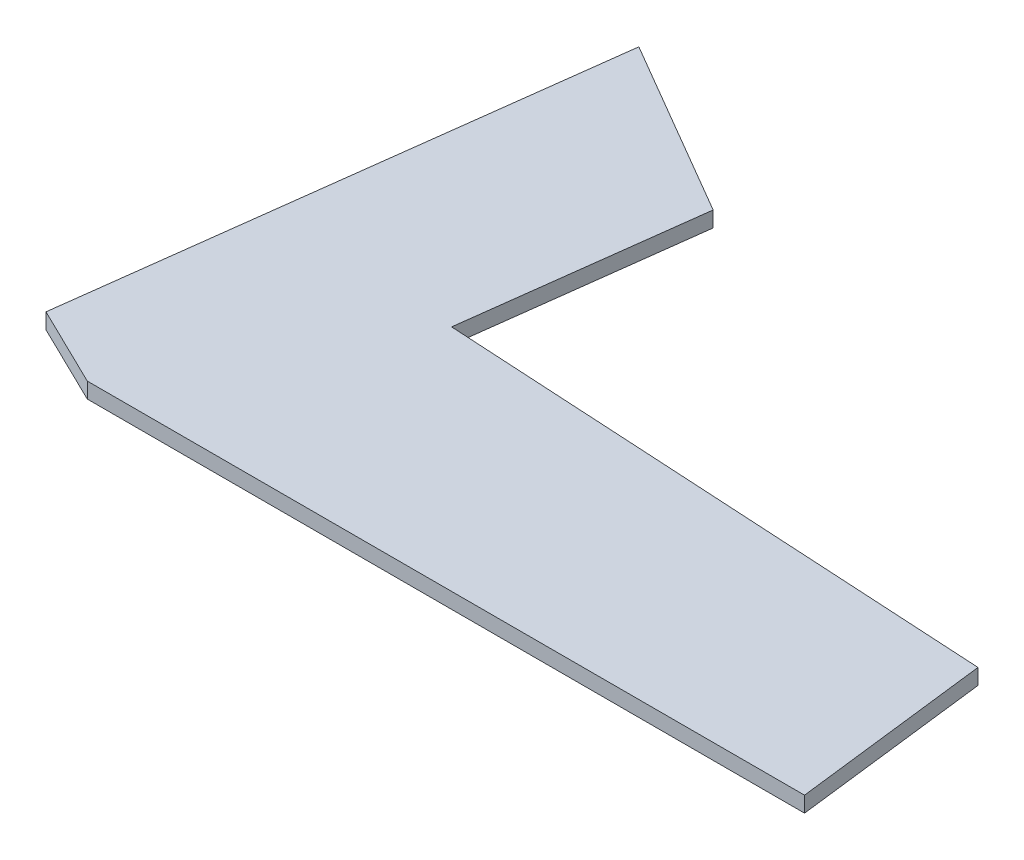
ISO-10303-21;
HEADER;
FILE_DESCRIPTION(('STEP AP214'),'2;1');
FILE_NAME('part.step','',(''),(''),'','','');
FILE_SCHEMA(('AUTOMOTIVE_DESIGN { 1 0 10303 214 1 1 1 1 }'));
ENDSEC;
DATA;
#1=APPLICATION_CONTEXT('core data for automotive mechanical design processes');
#2=APPLICATION_PROTOCOL_DEFINITION('international standard','automotive_design',2000,#1);
#3=PRODUCT_CONTEXT('',#1,'mechanical');
#4=PRODUCT('Part','Part','',(#3));
#5=PRODUCT_RELATED_PRODUCT_CATEGORY('part','',(#4));
#6=PRODUCT_DEFINITION_FORMATION('','',#4);
#7=PRODUCT_DEFINITION_CONTEXT('part definition',#1,'design');
#8=PRODUCT_DEFINITION('design','',#6,#7);
#9=PRODUCT_DEFINITION_SHAPE('','',#8);
#10=(LENGTH_UNIT() NAMED_UNIT(*) SI_UNIT(.MILLI.,.METRE.));
#11=(NAMED_UNIT(*) PLANE_ANGLE_UNIT() SI_UNIT($,.RADIAN.));
#12=(NAMED_UNIT(*) SI_UNIT($,.STERADIAN.) SOLID_ANGLE_UNIT());
#13=UNCERTAINTY_MEASURE_WITH_UNIT(LENGTH_MEASURE(1.E-05),#10,'distance_accuracy_value','');
#14=(GEOMETRIC_REPRESENTATION_CONTEXT(3) GLOBAL_UNCERTAINTY_ASSIGNED_CONTEXT((#13)) GLOBAL_UNIT_ASSIGNED_CONTEXT((#10,
#11,#12)) REPRESENTATION_CONTEXT('',''));
#15=CARTESIAN_POINT('',(0.,0.,0.));
#16=DIRECTION('',(0.,0.,1.));
#17=DIRECTION('',(1.,0.,0.));
#18=AXIS2_PLACEMENT_3D('',#15,#16,#17);
#19=CARTESIAN_POINT('',(35.7922680722665,1.,2.03372718008394));
#20=DIRECTION('',(-0.0567287916341405,0.,0.998389625446764));
#21=DIRECTION('',(0.998389625446764,0.,0.0567287916341405));
#22=AXIS2_PLACEMENT_3D('',#19,#20,#21);
#23=PLANE('',#22);
#24=DIRECTION('',(-0.998389625446764,0.,-0.0567287916341405));
#25=VECTOR('',#24,1.);
#26=CARTESIAN_POINT('',(35.7922680722665,0.,2.03372718008394));
#27=LINE('',#26,#25);
#28=CARTESIAN_POINT('',(35.7922680722665,0.,2.03372718008394));
#29=VERTEX_POINT('',#28);
#30=CARTESIAN_POINT('',(0.,0.,0.));
#31=VERTEX_POINT('',#30);
#32=EDGE_CURVE('E134',#29,#31,#27,.T.);
#33=ORIENTED_EDGE('',*,*,#32,.T.);
#34=DIRECTION('',(0.,-1.,0.));
#35=VECTOR('',#34,1.);
#36=CARTESIAN_POINT('',(0.,1.,0.));
#37=LINE('',#36,#35);
#38=CARTESIAN_POINT('',(0.,1.,0.));
#39=VERTEX_POINT('',#38);
#40=EDGE_CURVE('E11',#39,#31,#37,.T.);
#41=ORIENTED_EDGE('',*,*,#40,.F.);
#42=DIRECTION('',(-0.998389625446764,0.,-0.0567287916341405));
#43=VECTOR('',#42,1.);
#44=CARTESIAN_POINT('',(35.7922680722665,1.,2.03372718008394));
#45=LINE('',#44,#43);
#46=CARTESIAN_POINT('',(35.7922680722665,1.,2.03372718008394));
#47=VERTEX_POINT('',#46);
#48=EDGE_CURVE('E153',#47,#39,#45,.T.);
#49=ORIENTED_EDGE('',*,*,#48,.F.);
#50=DIRECTION('',(0.,-1.,0.));
#51=VECTOR('',#50,1.);
#52=CARTESIAN_POINT('',(35.7922680722665,1.,2.03372718008394));
#53=LINE('',#52,#51);
#54=EDGE_CURVE('E130',#47,#29,#53,.T.);
#55=ORIENTED_EDGE('',*,*,#54,.T.);
#56=EDGE_LOOP('',(#33,#41,#49,#55));
#57=FACE_BOUND('',#56,.T.);
#58=ADVANCED_FACE('F39',(#57),#23,.F.);
#59=CARTESIAN_POINT('',(0.,1.,0.));
#60=DIRECTION('',(-0.9920003980339,0.,-0.126234742842787));
#61=DIRECTION('',(-0.126234742842787,0.,0.9920003980339));
#62=AXIS2_PLACEMENT_3D('',#59,#60,#61);
#63=PLANE('',#62);
#64=DIRECTION('',(0.126234742842787,0.,-0.9920003980339));
#65=VECTOR('',#64,1.);
#66=CARTESIAN_POINT('',(0.,0.,0.));
#67=LINE('',#66,#65);
#68=CARTESIAN_POINT('',(1.8935211426418,0.,-14.8800059705085));
#69=VERTEX_POINT('',#68);
#70=EDGE_CURVE('E138',#31,#69,#67,.T.);
#71=ORIENTED_EDGE('',*,*,#70,.T.);
#72=DIRECTION('',(0.,-1.,0.));
#73=VECTOR('',#72,1.);
#74=CARTESIAN_POINT('',(1.8935211426418,1.,-14.8800059705085));
#75=LINE('',#74,#73);
#76=CARTESIAN_POINT('',(1.8935211426418,1.,-14.8800059705085));
#77=VERTEX_POINT('',#76);
#78=EDGE_CURVE('E48',#77,#69,#75,.T.);
#79=ORIENTED_EDGE('',*,*,#78,.F.);
#80=DIRECTION('',(0.126234742842787,0.,-0.9920003980339));
#81=VECTOR('',#80,1.);
#82=CARTESIAN_POINT('',(0.,1.,0.));
#83=LINE('',#82,#81);
#84=EDGE_CURVE('E96',#39,#77,#83,.T.);
#85=ORIENTED_EDGE('',*,*,#84,.F.);
#86=ORIENTED_EDGE('',*,*,#40,.T.);
#87=EDGE_LOOP('',(#71,#79,#85,#86));
#88=FACE_BOUND('',#87,.T.);
#89=ADVANCED_FACE('F187',(#88),#63,.F.);
#90=CARTESIAN_POINT('',(1.8935211426418,1.,-14.8800059705085));
#91=DIRECTION('',(-0.503985512182175,0.,0.863712106844909));
#92=DIRECTION('',(0.863712106844909,0.,0.503985512182175));
#93=AXIS2_PLACEMENT_3D('',#90,#91,#92);
#94=PLANE('',#93);
#95=DIRECTION('',(-0.863712106844909,0.,-0.503985512182175));
#96=VECTOR('',#95,1.);
#97=CARTESIAN_POINT('',(1.8935211426418,0.,-14.8800059705085));
#98=LINE('',#97,#96);
#99=CARTESIAN_POINT('',(-9.55066427305324,0.,-21.5578140069223));
#100=VERTEX_POINT('',#99);
#101=EDGE_CURVE('E141',#69,#100,#98,.T.);
#102=ORIENTED_EDGE('',*,*,#101,.T.);
#103=DIRECTION('',(0.,-1.,0.));
#104=VECTOR('',#103,1.);
#105=CARTESIAN_POINT('',(-9.55066427305324,1.,-21.5578140069223));
#106=LINE('',#105,#104);
#107=CARTESIAN_POINT('',(-9.55066427305324,1.,-21.5578140069223));
#108=VERTEX_POINT('',#107);
#109=EDGE_CURVE('E160',#108,#100,#106,.T.);
#110=ORIENTED_EDGE('',*,*,#109,.F.);
#111=DIRECTION('',(-0.863712106844909,0.,-0.503985512182175));
#112=VECTOR('',#111,1.);
#113=CARTESIAN_POINT('',(1.8935211426418,1.,-14.8800059705085));
#114=LINE('',#113,#112);
#115=EDGE_CURVE('E170',#77,#108,#114,.T.);
#116=ORIENTED_EDGE('',*,*,#115,.F.);
#117=ORIENTED_EDGE('',*,*,#78,.T.);
#118=EDGE_LOOP('',(#102,#110,#116,#117));
#119=FACE_BOUND('',#118,.T.);
#120=ADVANCED_FACE('F168',(#119),#94,.F.);
#121=CARTESIAN_POINT('',(-9.55066427305324,1.,-21.5578140069223));
#122=DIRECTION('',(0.9920003980339,0.,0.126234742842787));
#123=DIRECTION('',(0.126234742842787,0.,-0.9920003980339));
#124=AXIS2_PLACEMENT_3D('',#121,#122,#123);
#125=PLANE('',#124);
#126=DIRECTION('',(-0.126234742842787,0.,0.9920003980339));
#127=VECTOR('',#126,1.);
#128=CARTESIAN_POINT('',(-9.55066427305324,0.,-21.5578140069223));
#129=LINE('',#128,#127);
#130=CARTESIAN_POINT('',(-13.842645529708,0.,12.1701995262303));
#131=VERTEX_POINT('',#130);
#132=EDGE_CURVE('E144',#100,#131,#129,.T.);
#133=ORIENTED_EDGE('',*,*,#132,.T.);
#134=DIRECTION('',(0.,-1.,0.));
#135=VECTOR('',#134,1.);
#136=CARTESIAN_POINT('',(-13.842645529708,1.,12.1701995262303));
#137=LINE('',#136,#135);
#138=CARTESIAN_POINT('',(-13.842645529708,1.,12.1701995262303));
#139=VERTEX_POINT('',#138);
#140=EDGE_CURVE('E123',#139,#131,#137,.T.);
#141=ORIENTED_EDGE('',*,*,#140,.F.);
#142=DIRECTION('',(-0.126234742842787,0.,0.9920003980339));
#143=VECTOR('',#142,1.);
#144=CARTESIAN_POINT('',(-9.55066427305324,1.,-21.5578140069223));
#145=LINE('',#144,#143);
#146=EDGE_CURVE('E112',#108,#139,#145,.T.);
#147=ORIENTED_EDGE('',*,*,#146,.F.);
#148=ORIENTED_EDGE('',*,*,#109,.T.);
#149=EDGE_LOOP('',(#133,#141,#147,#148));
#150=FACE_BOUND('',#149,.T.);
#151=ADVANCED_FACE('F176',(#150),#125,.F.);
#152=CARTESIAN_POINT('',(-13.842645529708,1.,12.1701995262303));
#153=DIRECTION('',(0.438441247874848,0.,-0.898759852330947));
#154=DIRECTION('',(-0.898759852330947,0.,-0.438441247874848));
#155=AXIS2_PLACEMENT_3D('',#152,#153,#154);
#156=PLANE('',#155);
#157=DIRECTION('',(0.898759852330947,0.,0.438441247874848));
#158=VECTOR('',#157,1.);
#159=CARTESIAN_POINT('',(-13.842645529708,0.,12.1701995262303));
#160=LINE('',#159,#158);
#161=CARTESIAN_POINT('',(-8.67477637880496,0.,14.6912367015107));
#162=VERTEX_POINT('',#161);
#163=EDGE_CURVE('E121',#131,#162,#160,.T.);
#164=ORIENTED_EDGE('',*,*,#163,.T.);
#165=DIRECTION('',(0.,-1.,0.));
#166=VECTOR('',#165,1.);
#167=CARTESIAN_POINT('',(-8.67477637880496,1.,14.6912367015107));
#168=LINE('',#167,#166);
#169=CARTESIAN_POINT('',(-8.67477637880496,1.,14.6912367015107));
#170=VERTEX_POINT('',#169);
#171=EDGE_CURVE('E118',#170,#162,#168,.T.);
#172=ORIENTED_EDGE('',*,*,#171,.F.);
#173=DIRECTION('',(0.898759852330947,0.,0.438441247874848));
#174=VECTOR('',#173,1.);
#175=CARTESIAN_POINT('',(-13.842645529708,1.,12.1701995262303));
#176=LINE('',#175,#174);
#177=EDGE_CURVE('E106',#139,#170,#176,.T.);
#178=ORIENTED_EDGE('',*,*,#177,.F.);
#179=ORIENTED_EDGE('',*,*,#140,.T.);
#180=EDGE_LOOP('',(#164,#172,#178,#179));
#181=FACE_BOUND('',#180,.T.);
#182=ADVANCED_FACE('F119',(#181),#156,.F.);
#183=CARTESIAN_POINT('',(-8.67477637880496,1.,14.6912367015107));
#184=DIRECTION('',(0.,0.,-1.));
#185=DIRECTION('',(-1.,0.,0.));
#186=AXIS2_PLACEMENT_3D('',#183,#184,#185);
#187=PLANE('',#186);
#188=DIRECTION('',(1.,0.,0.));
#189=VECTOR('',#188,1.);
#190=CARTESIAN_POINT('',(-8.67477637880496,0.,14.6912367015107));
#191=LINE('',#190,#189);
#192=CARTESIAN_POINT('',(37.3252236211951,0.,14.6912367015107));
#193=VERTEX_POINT('',#192);
#194=EDGE_CURVE('E82',#162,#193,#191,.T.);
#195=ORIENTED_EDGE('',*,*,#194,.T.);
#196=DIRECTION('',(0.,-1.,0.));
#197=VECTOR('',#196,1.);
#198=CARTESIAN_POINT('',(37.3252236211951,1.,14.6912367015107));
#199=LINE('',#198,#197);
#200=CARTESIAN_POINT('',(37.3252236211951,1.,14.6912367015107));
#201=VERTEX_POINT('',#200);
#202=EDGE_CURVE('E124',#201,#193,#199,.T.);
#203=ORIENTED_EDGE('',*,*,#202,.F.);
#204=DIRECTION('',(1.,0.,0.));
#205=VECTOR('',#204,1.);
#206=CARTESIAN_POINT('',(-8.67477637880496,1.,14.6912367015107));
#207=LINE('',#206,#205);
#208=EDGE_CURVE('E110',#170,#201,#207,.T.);
#209=ORIENTED_EDGE('',*,*,#208,.F.);
#210=ORIENTED_EDGE('',*,*,#171,.T.);
#211=EDGE_LOOP('',(#195,#203,#209,#210));
#212=FACE_BOUND('',#211,.T.);
#213=ADVANCED_FACE('F126',(#212),#187,.F.);
#214=CARTESIAN_POINT('',(37.3252236211951,1.,14.6912367015107));
#215=DIRECTION('',(-0.992745844817785,0.,0.120231807759102));
#216=DIRECTION('',(0.120231807759102,0.,0.992745844817785));
#217=AXIS2_PLACEMENT_3D('',#214,#215,#216);
#218=PLANE('',#217);
#219=DIRECTION('',(-0.120231807759102,0.,-0.992745844817785));
#220=VECTOR('',#219,1.);
#221=CARTESIAN_POINT('',(37.3252236211951,0.,14.6912367015107));
#222=LINE('',#221,#220);
#223=EDGE_CURVE('E88',#193,#29,#222,.T.);
#224=ORIENTED_EDGE('',*,*,#223,.T.);
#225=ORIENTED_EDGE('',*,*,#54,.F.);
#226=DIRECTION('',(-0.120231807759102,0.,-0.992745844817785));
#227=VECTOR('',#226,1.);
#228=CARTESIAN_POINT('',(37.3252236211951,1.,14.6912367015107));
#229=LINE('',#228,#227);
#230=EDGE_CURVE('E56',#201,#47,#229,.T.);
#231=ORIENTED_EDGE('',*,*,#230,.F.);
#232=ORIENTED_EDGE('',*,*,#202,.T.);
#233=EDGE_LOOP('',(#224,#225,#231,#232));
#234=FACE_BOUND('',#233,.T.);
#235=ADVANCED_FACE('F201',(#234),#218,.F.);
#236=CARTESIAN_POINT('',(0.,1.,0.));
#237=DIRECTION('',(0.,-1.,0.));
#238=DIRECTION('',(0.,0.,-1.));
#239=AXIS2_PLACEMENT_3D('',#236,#237,#238);
#240=PLANE('',#239);
#241=ORIENTED_EDGE('',*,*,#48,.T.);
#242=ORIENTED_EDGE('',*,*,#84,.T.);
#243=ORIENTED_EDGE('',*,*,#115,.T.);
#244=ORIENTED_EDGE('',*,*,#146,.T.);
#245=ORIENTED_EDGE('',*,*,#177,.T.);
#246=ORIENTED_EDGE('',*,*,#208,.T.);
#247=ORIENTED_EDGE('',*,*,#230,.T.);
#248=EDGE_LOOP('',(#241,#242,#243,#244,#245,#246,#247));
#249=FACE_BOUND('',#248,.T.);
#250=ADVANCED_FACE('F108',(#249),#240,.F.);
#251=CARTESIAN_POINT('',(0.,0.,0.));
#252=DIRECTION('',(0.,-1.,0.));
#253=DIRECTION('',(0.,0.,-1.));
#254=AXIS2_PLACEMENT_3D('',#251,#252,#253);
#255=PLANE('',#254);
#256=ORIENTED_EDGE('',*,*,#32,.F.);
#257=ORIENTED_EDGE('',*,*,#223,.F.);
#258=ORIENTED_EDGE('',*,*,#194,.F.);
#259=ORIENTED_EDGE('',*,*,#163,.F.);
#260=ORIENTED_EDGE('',*,*,#132,.F.);
#261=ORIENTED_EDGE('',*,*,#101,.F.);
#262=ORIENTED_EDGE('',*,*,#70,.F.);
#263=EDGE_LOOP('',(#256,#257,#258,#259,#260,#261,#262));
#264=FACE_BOUND('',#263,.T.);
#265=ADVANCED_FACE('F174',(#264),#255,.T.);
#266=CLOSED_SHELL('',(#58,#89,#120,#151,#182,#213,#235,#250,#265));
#267=MANIFOLD_SOLID_BREP('B2',#266);
#268=ADVANCED_BREP_SHAPE_REPRESENTATION('',(#18,#267),#14);
#269=SHAPE_DEFINITION_REPRESENTATION(#9,#268);
ENDSEC;
END-ISO-10303-21;
